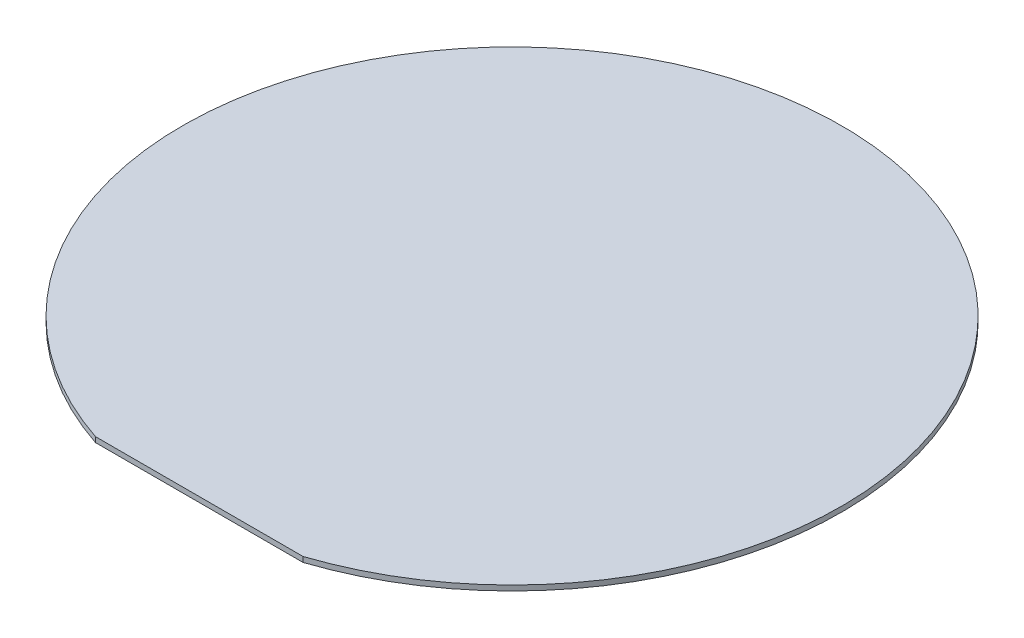
ISO-10303-21;
HEADER;
FILE_DESCRIPTION(('STEP AP214'),'2;1');
FILE_NAME('part.step','',(''),(''),'','','');
FILE_SCHEMA(('AUTOMOTIVE_DESIGN { 1 0 10303 214 1 1 1 1 }'));
ENDSEC;
DATA;
#1=APPLICATION_CONTEXT('core data for automotive mechanical design processes');
#2=APPLICATION_PROTOCOL_DEFINITION('international standard','automotive_design',2000,#1);
#3=PRODUCT_CONTEXT('',#1,'mechanical');
#4=PRODUCT('Part','Part','',(#3));
#5=PRODUCT_RELATED_PRODUCT_CATEGORY('part','',(#4));
#6=PRODUCT_DEFINITION_FORMATION('','',#4);
#7=PRODUCT_DEFINITION_CONTEXT('part definition',#1,'design');
#8=PRODUCT_DEFINITION('design','',#6,#7);
#9=PRODUCT_DEFINITION_SHAPE('','',#8);
#10=(LENGTH_UNIT() NAMED_UNIT(*) SI_UNIT(.MILLI.,.METRE.));
#11=(NAMED_UNIT(*) PLANE_ANGLE_UNIT() SI_UNIT($,.RADIAN.));
#12=(NAMED_UNIT(*) SI_UNIT($,.STERADIAN.) SOLID_ANGLE_UNIT());
#13=UNCERTAINTY_MEASURE_WITH_UNIT(LENGTH_MEASURE(1.E-05),#10,'distance_accuracy_value','');
#14=(GEOMETRIC_REPRESENTATION_CONTEXT(3) GLOBAL_UNCERTAINTY_ASSIGNED_CONTEXT((#13)) GLOBAL_UNIT_ASSIGNED_CONTEXT((#10,
#11,#12)) REPRESENTATION_CONTEXT('',''));
#15=CARTESIAN_POINT('',(0.,0.,0.));
#16=DIRECTION('',(0.,0.,1.));
#17=DIRECTION('',(1.,0.,0.));
#18=AXIS2_PLACEMENT_3D('',#15,#16,#17);
#19=CARTESIAN_POINT('',(0.,0.4,0.));
#20=DIRECTION('',(0.,-1.,0.));
#21=DIRECTION('',(0.,0.,-1.));
#22=AXIS2_PLACEMENT_3D('',#19,#20,#21);
#23=CYLINDRICAL_SURFACE('',#22,25.4);
#24=CARTESIAN_POINT('',(0.,0.,0.));
#25=DIRECTION('',(0.,1.,0.));
#26=DIRECTION('',(0.,0.,1.));
#27=AXIS2_PLACEMENT_3D('',#24,#25,#26);
#28=CIRCLE('',#27,25.4);
#29=CARTESIAN_POINT('',(8.,0.,24.1072603171742));
#30=VERTEX_POINT('',#29);
#31=CARTESIAN_POINT('',(-8.,0.,24.1072603171742));
#32=VERTEX_POINT('',#31);
#33=EDGE_CURVE('E73',#30,#32,#28,.T.);
#34=ORIENTED_EDGE('',*,*,#33,.T.);
#35=DIRECTION('',(0.,-1.,0.));
#36=VECTOR('',#35,1.);
#37=CARTESIAN_POINT('',(-8.,0.4,24.1072603171742));
#38=LINE('',#37,#36);
#39=CARTESIAN_POINT('',(-8.,0.4,24.1072603171742));
#40=VERTEX_POINT('',#39);
#41=EDGE_CURVE('E11',#40,#32,#38,.T.);
#42=ORIENTED_EDGE('',*,*,#41,.F.);
#43=CARTESIAN_POINT('',(0.,0.4,0.));
#44=DIRECTION('',(0.,1.,0.));
#45=DIRECTION('',(0.,0.,1.));
#46=AXIS2_PLACEMENT_3D('',#43,#44,#45);
#47=CIRCLE('',#46,25.4);
#48=CARTESIAN_POINT('',(8.,0.4,24.1072603171742));
#49=VERTEX_POINT('',#48);
#50=EDGE_CURVE('E72',#49,#40,#47,.T.);
#51=ORIENTED_EDGE('',*,*,#50,.F.);
#52=DIRECTION('',(0.,-1.,0.));
#53=VECTOR('',#52,1.);
#54=CARTESIAN_POINT('',(8.,0.4,24.1072603171742));
#55=LINE('',#54,#53);
#56=EDGE_CURVE('E50',#49,#30,#55,.T.);
#57=ORIENTED_EDGE('',*,*,#56,.T.);
#58=EDGE_LOOP('',(#34,#42,#51,#57));
#59=FACE_BOUND('',#58,.T.);
#60=ADVANCED_FACE('F42',(#59),#23,.T.);
#61=CARTESIAN_POINT('',(-8.,0.4,24.1072603171742));
#62=DIRECTION('',(0.,0.,-1.));
#63=DIRECTION('',(-1.,0.,0.));
#64=AXIS2_PLACEMENT_3D('',#61,#62,#63);
#65=PLANE('',#64);
#66=DIRECTION('',(1.,0.,0.));
#67=VECTOR('',#66,1.);
#68=CARTESIAN_POINT('',(-8.,0.,24.1072603171742));
#69=LINE('',#68,#67);
#70=EDGE_CURVE('E65',#32,#30,#69,.T.);
#71=ORIENTED_EDGE('',*,*,#70,.T.);
#72=ORIENTED_EDGE('',*,*,#56,.F.);
#73=DIRECTION('',(1.,0.,0.));
#74=VECTOR('',#73,1.);
#75=CARTESIAN_POINT('',(-8.,0.4,24.1072603171742));
#76=LINE('',#75,#74);
#77=EDGE_CURVE('E57',#40,#49,#76,.T.);
#78=ORIENTED_EDGE('',*,*,#77,.F.);
#79=ORIENTED_EDGE('',*,*,#41,.T.);
#80=EDGE_LOOP('',(#71,#72,#78,#79));
#81=FACE_BOUND('',#80,.T.);
#82=ADVANCED_FACE('F68',(#81),#65,.F.);
#83=CARTESIAN_POINT('',(0.,0.4,0.));
#84=DIRECTION('',(0.,1.,0.));
#85=DIRECTION('',(0.,0.,1.));
#86=AXIS2_PLACEMENT_3D('',#83,#84,#85);
#87=PLANE('',#86);
#88=ORIENTED_EDGE('',*,*,#50,.T.);
#89=ORIENTED_EDGE('',*,*,#77,.T.);
#90=EDGE_LOOP('',(#88,#89));
#91=FACE_BOUND('',#90,.T.);
#92=ADVANCED_FACE('F80',(#91),#87,.T.);
#93=CARTESIAN_POINT('',(0.,0.,0.));
#94=DIRECTION('',(0.,1.,0.));
#95=DIRECTION('',(0.,0.,1.));
#96=AXIS2_PLACEMENT_3D('',#93,#94,#95);
#97=PLANE('',#96);
#98=ORIENTED_EDGE('',*,*,#33,.F.);
#99=ORIENTED_EDGE('',*,*,#70,.F.);
#100=EDGE_LOOP('',(#98,#99));
#101=FACE_BOUND('',#100,.T.);
#102=ADVANCED_FACE('F76',(#101),#97,.F.);
#103=CLOSED_SHELL('',(#60,#82,#92,#102));
#104=MANIFOLD_SOLID_BREP('B2',#103);
#105=ADVANCED_BREP_SHAPE_REPRESENTATION('',(#18,#104),#14);
#106=SHAPE_DEFINITION_REPRESENTATION(#9,#105);
ENDSEC;
END-ISO-10303-21;
